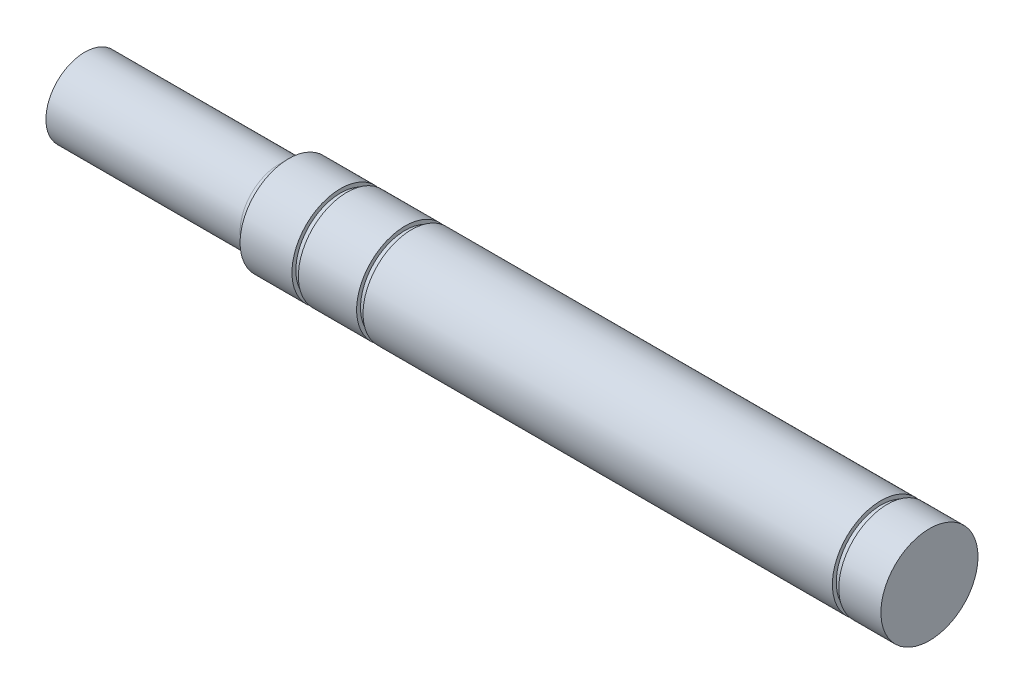
ISO-10303-21;
HEADER;
FILE_DESCRIPTION(('STEP AP214'),'2;1');
FILE_NAME('part.step','',(''),(''),'','','');
FILE_SCHEMA(('AUTOMOTIVE_DESIGN { 1 0 10303 214 1 1 1 1 }'));
ENDSEC;
DATA;
#1=APPLICATION_CONTEXT('core data for automotive mechanical design processes');
#2=APPLICATION_PROTOCOL_DEFINITION('international standard','automotive_design',2000,#1);
#3=PRODUCT_CONTEXT('',#1,'mechanical');
#4=PRODUCT('Part','Part','',(#3));
#5=PRODUCT_RELATED_PRODUCT_CATEGORY('part','',(#4));
#6=PRODUCT_DEFINITION_FORMATION('','',#4);
#7=PRODUCT_DEFINITION_CONTEXT('part definition',#1,'design');
#8=PRODUCT_DEFINITION('design','',#6,#7);
#9=PRODUCT_DEFINITION_SHAPE('','',#8);
#10=(LENGTH_UNIT() NAMED_UNIT(*) SI_UNIT(.MILLI.,.METRE.));
#11=(NAMED_UNIT(*) PLANE_ANGLE_UNIT() SI_UNIT($,.RADIAN.));
#12=(NAMED_UNIT(*) SI_UNIT($,.STERADIAN.) SOLID_ANGLE_UNIT());
#13=UNCERTAINTY_MEASURE_WITH_UNIT(LENGTH_MEASURE(1.E-05),#10,'distance_accuracy_value','');
#14=(GEOMETRIC_REPRESENTATION_CONTEXT(3) GLOBAL_UNCERTAINTY_ASSIGNED_CONTEXT((#13)) GLOBAL_UNIT_ASSIGNED_CONTEXT((#10,
#11,#12)) REPRESENTATION_CONTEXT('',''));
#15=CARTESIAN_POINT('',(0.,0.,0.));
#16=DIRECTION('',(0.,0.,1.));
#17=DIRECTION('',(1.,0.,0.));
#18=AXIS2_PLACEMENT_3D('',#15,#16,#17);
#19=CARTESIAN_POINT('',(-33.2456680527159,0.,0.));
#20=DIRECTION('',(-1.,0.,0.));
#21=DIRECTION('',(0.,0.,1.));
#22=AXIS2_PLACEMENT_3D('',#19,#20,#21);
#23=PLANE('',#22);
#24=CARTESIAN_POINT('',(-33.2456680527159,-282.754869364823,0.));
#25=DIRECTION('',(1.,0.,0.));
#26=DIRECTION('',(0.,0.,-1.));
#27=AXIS2_PLACEMENT_3D('',#24,#25,#26);
#28=CIRCLE('',#27,5.);
#29=CARTESIAN_POINT('',(-33.2456680527159,-282.754869364823,-5.));
#30=VERTEX_POINT('',#29);
#31=EDGE_CURVE('E91',#30,#30,#28,.T.);
#32=ORIENTED_EDGE('',*,*,#31,.T.);
#33=EDGE_LOOP('',(#32));
#34=FACE_BOUND('',#33,.T.);
#35=ADVANCED_FACE('F39',(#34),#23,.F.);
#36=CARTESIAN_POINT('',(-120.245668052716,4.17185966511118E-13,0.));
#37=DIRECTION('',(-1.,0.,0.));
#38=DIRECTION('',(0.,0.,1.));
#39=AXIS2_PLACEMENT_3D('',#36,#37,#38);
#40=PLANE('',#39);
#41=CARTESIAN_POINT('',(-120.245668052716,-282.754869364823,0.));
#42=DIRECTION('',(1.,0.,0.));
#43=DIRECTION('',(0.,0.,-1.));
#44=AXIS2_PLACEMENT_3D('',#41,#42,#43);
#45=CIRCLE('',#44,4.);
#46=CARTESIAN_POINT('',(-120.245668052716,-282.754869364823,-4.));
#47=VERTEX_POINT('',#46);
#48=EDGE_CURVE('E11',#47,#47,#45,.T.);
#49=ORIENTED_EDGE('',*,*,#48,.F.);
#50=EDGE_LOOP('',(#49));
#51=FACE_BOUND('',#50,.T.);
#52=ADVANCED_FACE('F114',(#51),#40,.T.);
#53=CARTESIAN_POINT('',(-33.2456680527159,-282.754869364823,0.));
#54=DIRECTION('',(1.,0.,0.));
#55=DIRECTION('',(0.,0.,-1.));
#56=AXIS2_PLACEMENT_3D('',#53,#54,#55);
#57=CYLINDRICAL_SURFACE('',#56,4.);
#58=CARTESIAN_POINT('',(-100.245668052716,-282.754869364823,0.));
#59=DIRECTION('',(1.,0.,0.));
#60=DIRECTION('',(0.,0.,-1.));
#61=AXIS2_PLACEMENT_3D('',#58,#59,#60);
#62=CIRCLE('',#61,4.);
#63=CARTESIAN_POINT('',(-100.245668052716,-282.754869364823,-4.));
#64=VERTEX_POINT('',#63);
#65=EDGE_CURVE('E45',#64,#64,#62,.T.);
#66=ORIENTED_EDGE('',*,*,#65,.F.);
#67=EDGE_LOOP('',(#66));
#68=FACE_BOUND('',#67,.T.);
#69=ORIENTED_EDGE('',*,*,#48,.T.);
#70=EDGE_LOOP('',(#69));
#71=FACE_BOUND('',#70,.T.);
#72=ADVANCED_FACE('F118',(#68,#71),#57,.T.);
#73=CARTESIAN_POINT('',(-100.245668052716,-282.754869364823,0.));
#74=DIRECTION('',(1.,0.,0.));
#75=DIRECTION('',(0.,0.,-1.));
#76=AXIS2_PLACEMENT_3D('',#73,#74,#75);
#77=TOROIDAL_SURFACE('',#76,5.,1.);
#78=CARTESIAN_POINT('',(-99.2456680527159,-282.754869364823,0.));
#79=DIRECTION('',(1.,0.,0.));
#80=DIRECTION('',(0.,0.,-1.));
#81=AXIS2_PLACEMENT_3D('',#78,#79,#80);
#82=CIRCLE('',#81,5.);
#83=CARTESIAN_POINT('',(-99.2456680527159,-282.754869364823,-5.));
#84=VERTEX_POINT('',#83);
#85=EDGE_CURVE('E49',#84,#84,#82,.T.);
#86=ORIENTED_EDGE('',*,*,#85,.F.);
#87=EDGE_LOOP('',(#86));
#88=FACE_BOUND('',#87,.T.);
#89=ORIENTED_EDGE('',*,*,#65,.T.);
#90=EDGE_LOOP('',(#89));
#91=FACE_BOUND('',#90,.T.);
#92=ADVANCED_FACE('F123',(#88,#91),#77,.F.);
#93=CARTESIAN_POINT('',(-33.2456680527159,-282.754869364823,0.));
#94=DIRECTION('',(1.,0.,0.));
#95=DIRECTION('',(0.,0.,-1.));
#96=AXIS2_PLACEMENT_3D('',#93,#94,#95);
#97=CYLINDRICAL_SURFACE('',#96,5.);
#98=ORIENTED_EDGE('',*,*,#85,.T.);
#99=EDGE_LOOP('',(#98));
#100=FACE_BOUND('',#99,.T.);
#101=CARTESIAN_POINT('',(-93.9056680527159,-282.754869364823,0.));
#102=DIRECTION('',(1.,0.,0.));
#103=DIRECTION('',(0.,0.,-1.));
#104=AXIS2_PLACEMENT_3D('',#101,#102,#103);
#105=CIRCLE('',#104,5.);
#106=CARTESIAN_POINT('',(-93.9056680527159,-282.754869364823,-5.));
#107=VERTEX_POINT('',#106);
#108=EDGE_CURVE('E53',#107,#107,#105,.T.);
#109=ORIENTED_EDGE('',*,*,#108,.F.);
#110=EDGE_LOOP('',(#109));
#111=FACE_BOUND('',#110,.T.);
#112=ADVANCED_FACE('F129',(#100,#111),#97,.T.);
#113=CARTESIAN_POINT('',(-93.9056680527159,0.,0.));
#114=DIRECTION('',(1.,0.,0.));
#115=DIRECTION('',(0.,0.,-1.));
#116=AXIS2_PLACEMENT_3D('',#113,#114,#115);
#117=PLANE('',#116);
#118=ORIENTED_EDGE('',*,*,#108,.T.);
#119=EDGE_LOOP('',(#118));
#120=FACE_BOUND('',#119,.T.);
#121=CARTESIAN_POINT('',(-93.9056680527159,-282.754869364823,0.));
#122=DIRECTION('',(1.,0.,0.));
#123=DIRECTION('',(0.,0.,-1.));
#124=AXIS2_PLACEMENT_3D('',#121,#122,#123);
#125=CIRCLE('',#124,4.59999999999999);
#126=CARTESIAN_POINT('',(-93.9056680527159,-282.754869364823,-4.59999999999999));
#127=VERTEX_POINT('',#126);
#128=EDGE_CURVE('E58',#127,#127,#125,.T.);
#129=ORIENTED_EDGE('',*,*,#128,.F.);
#130=EDGE_LOOP('',(#129));
#131=FACE_BOUND('',#130,.T.);
#132=ADVANCED_FACE('F133',(#120,#131),#117,.T.);
#133=CARTESIAN_POINT('',(-33.2456680527159,-282.754869364823,0.));
#134=DIRECTION('',(1.,0.,0.));
#135=DIRECTION('',(0.,0.,-1.));
#136=AXIS2_PLACEMENT_3D('',#133,#134,#135);
#137=CYLINDRICAL_SURFACE('',#136,4.59999999999999);
#138=ORIENTED_EDGE('',*,*,#128,.T.);
#139=EDGE_LOOP('',(#138));
#140=FACE_BOUND('',#139,.T.);
#141=CARTESIAN_POINT('',(-93.2456680527159,-282.754869364823,0.));
#142=DIRECTION('',(1.,0.,0.));
#143=DIRECTION('',(0.,0.,-1.));
#144=AXIS2_PLACEMENT_3D('',#141,#142,#143);
#145=CIRCLE('',#144,4.59999999999999);
#146=CARTESIAN_POINT('',(-93.2456680527159,-282.754869364823,-4.59999999999999));
#147=VERTEX_POINT('',#146);
#148=EDGE_CURVE('E61',#147,#147,#145,.T.);
#149=ORIENTED_EDGE('',*,*,#148,.F.);
#150=EDGE_LOOP('',(#149));
#151=FACE_BOUND('',#150,.T.);
#152=ADVANCED_FACE('F137',(#140,#151),#137,.T.);
#153=CARTESIAN_POINT('',(-93.2456680527159,0.,0.));
#154=DIRECTION('',(-1.,0.,0.));
#155=DIRECTION('',(0.,0.,1.));
#156=AXIS2_PLACEMENT_3D('',#153,#154,#155);
#157=PLANE('',#156);
#158=ORIENTED_EDGE('',*,*,#148,.T.);
#159=EDGE_LOOP('',(#158));
#160=FACE_BOUND('',#159,.T.);
#161=CARTESIAN_POINT('',(-93.2456680527159,-282.754869364823,0.));
#162=DIRECTION('',(1.,0.,0.));
#163=DIRECTION('',(0.,0.,-1.));
#164=AXIS2_PLACEMENT_3D('',#161,#162,#163);
#165=CIRCLE('',#164,5.);
#166=CARTESIAN_POINT('',(-93.2456680527159,-282.754869364823,-5.));
#167=VERTEX_POINT('',#166);
#168=EDGE_CURVE('E64',#167,#167,#165,.T.);
#169=ORIENTED_EDGE('',*,*,#168,.F.);
#170=EDGE_LOOP('',(#169));
#171=FACE_BOUND('',#170,.T.);
#172=ADVANCED_FACE('F141',(#160,#171),#157,.T.);
#173=CARTESIAN_POINT('',(-33.2456680527159,-282.754869364823,0.));
#174=DIRECTION('',(1.,0.,0.));
#175=DIRECTION('',(0.,0.,-1.));
#176=AXIS2_PLACEMENT_3D('',#173,#174,#175);
#177=CYLINDRICAL_SURFACE('',#176,5.);
#178=ORIENTED_EDGE('',*,*,#168,.T.);
#179=EDGE_LOOP('',(#178));
#180=FACE_BOUND('',#179,.T.);
#181=CARTESIAN_POINT('',(-87.2456680527159,-282.754869364823,0.));
#182=DIRECTION('',(1.,0.,0.));
#183=DIRECTION('',(0.,0.,-1.));
#184=AXIS2_PLACEMENT_3D('',#181,#182,#183);
#185=CIRCLE('',#184,5.);
#186=CARTESIAN_POINT('',(-87.2456680527159,-282.754869364823,-5.));
#187=VERTEX_POINT('',#186);
#188=EDGE_CURVE('E67',#187,#187,#185,.T.);
#189=ORIENTED_EDGE('',*,*,#188,.F.);
#190=EDGE_LOOP('',(#189));
#191=FACE_BOUND('',#190,.T.);
#192=ADVANCED_FACE('F145',(#180,#191),#177,.T.);
#193=CARTESIAN_POINT('',(-87.2456680527159,0.,0.));
#194=DIRECTION('',(-1.,0.,0.));
#195=DIRECTION('',(0.,0.,1.));
#196=AXIS2_PLACEMENT_3D('',#193,#194,#195);
#197=PLANE('',#196);
#198=CARTESIAN_POINT('',(-87.2456680527159,-282.754869364823,0.));
#199=DIRECTION('',(1.,0.,0.));
#200=DIRECTION('',(0.,0.,-1.));
#201=AXIS2_PLACEMENT_3D('',#198,#199,#200);
#202=CIRCLE('',#201,4.59999999999999);
#203=CARTESIAN_POINT('',(-87.2456680527159,-282.754869364823,-4.59999999999999));
#204=VERTEX_POINT('',#203);
#205=EDGE_CURVE('E70',#204,#204,#202,.T.);
#206=ORIENTED_EDGE('',*,*,#205,.F.);
#207=EDGE_LOOP('',(#206));
#208=FACE_BOUND('',#207,.T.);
#209=ORIENTED_EDGE('',*,*,#188,.T.);
#210=EDGE_LOOP('',(#209));
#211=FACE_BOUND('',#210,.T.);
#212=ADVANCED_FACE('F149',(#208,#211),#197,.F.);
#213=CARTESIAN_POINT('',(-33.2456680527159,-282.754869364823,0.));
#214=DIRECTION('',(1.,0.,0.));
#215=DIRECTION('',(0.,0.,-1.));
#216=AXIS2_PLACEMENT_3D('',#213,#214,#215);
#217=CYLINDRICAL_SURFACE('',#216,4.60000000000002);
#218=CARTESIAN_POINT('',(-86.5856680527159,-282.754869364823,0.));
#219=DIRECTION('',(1.,0.,0.));
#220=DIRECTION('',(0.,0.,-1.));
#221=AXIS2_PLACEMENT_3D('',#218,#219,#220);
#222=CIRCLE('',#221,4.60000000000005);
#223=CARTESIAN_POINT('',(-86.5856680527159,-282.754869364823,-4.60000000000005));
#224=VERTEX_POINT('',#223);
#225=EDGE_CURVE('E73',#224,#224,#222,.T.);
#226=ORIENTED_EDGE('',*,*,#225,.F.);
#227=EDGE_LOOP('',(#226));
#228=FACE_BOUND('',#227,.T.);
#229=ORIENTED_EDGE('',*,*,#205,.T.);
#230=EDGE_LOOP('',(#229));
#231=FACE_BOUND('',#230,.T.);
#232=ADVANCED_FACE('F153',(#228,#231),#217,.T.);
#233=CARTESIAN_POINT('',(-86.5856680527159,0.,0.));
#234=DIRECTION('',(1.,0.,0.));
#235=DIRECTION('',(0.,0.,-1.));
#236=AXIS2_PLACEMENT_3D('',#233,#234,#235);
#237=PLANE('',#236);
#238=CARTESIAN_POINT('',(-86.5856680527159,-282.754869364823,0.));
#239=DIRECTION('',(1.,0.,0.));
#240=DIRECTION('',(0.,0.,-1.));
#241=AXIS2_PLACEMENT_3D('',#238,#239,#240);
#242=CIRCLE('',#241,5.);
#243=CARTESIAN_POINT('',(-86.5856680527159,-282.754869364823,-5.));
#244=VERTEX_POINT('',#243);
#245=EDGE_CURVE('E76',#244,#244,#242,.T.);
#246=ORIENTED_EDGE('',*,*,#245,.F.);
#247=EDGE_LOOP('',(#246));
#248=FACE_BOUND('',#247,.T.);
#249=ORIENTED_EDGE('',*,*,#225,.T.);
#250=EDGE_LOOP('',(#249));
#251=FACE_BOUND('',#250,.T.);
#252=ADVANCED_FACE('F157',(#248,#251),#237,.F.);
#253=CARTESIAN_POINT('',(-33.2456680527159,-282.754869364823,0.));
#254=DIRECTION('',(1.,0.,0.));
#255=DIRECTION('',(0.,0.,-1.));
#256=AXIS2_PLACEMENT_3D('',#253,#254,#255);
#257=CYLINDRICAL_SURFACE('',#256,5.);
#258=ORIENTED_EDGE('',*,*,#245,.T.);
#259=EDGE_LOOP('',(#258));
#260=FACE_BOUND('',#259,.T.);
#261=CARTESIAN_POINT('',(-38.2456680527159,-282.754869364823,0.));
#262=DIRECTION('',(1.,0.,0.));
#263=DIRECTION('',(0.,0.,-1.));
#264=AXIS2_PLACEMENT_3D('',#261,#262,#263);
#265=CIRCLE('',#264,5.);
#266=CARTESIAN_POINT('',(-38.2456680527159,-282.754869364823,-5.));
#267=VERTEX_POINT('',#266);
#268=EDGE_CURVE('E79',#267,#267,#265,.T.);
#269=ORIENTED_EDGE('',*,*,#268,.F.);
#270=EDGE_LOOP('',(#269));
#271=FACE_BOUND('',#270,.T.);
#272=ADVANCED_FACE('F161',(#260,#271),#257,.T.);
#273=CARTESIAN_POINT('',(-38.2456680527159,0.,0.));
#274=DIRECTION('',(1.,0.,0.));
#275=DIRECTION('',(0.,0.,-1.));
#276=AXIS2_PLACEMENT_3D('',#273,#274,#275);
#277=PLANE('',#276);
#278=ORIENTED_EDGE('',*,*,#268,.T.);
#279=EDGE_LOOP('',(#278));
#280=FACE_BOUND('',#279,.T.);
#281=CARTESIAN_POINT('',(-38.2456680527159,-282.754869364823,0.));
#282=DIRECTION('',(1.,0.,0.));
#283=DIRECTION('',(0.,0.,-1.));
#284=AXIS2_PLACEMENT_3D('',#281,#282,#283);
#285=CIRCLE('',#284,4.59999999999999);
#286=CARTESIAN_POINT('',(-38.2456680527159,-282.754869364823,-4.59999999999999));
#287=VERTEX_POINT('',#286);
#288=EDGE_CURVE('E82',#287,#287,#285,.T.);
#289=ORIENTED_EDGE('',*,*,#288,.F.);
#290=EDGE_LOOP('',(#289));
#291=FACE_BOUND('',#290,.T.);
#292=ADVANCED_FACE('F110',(#280,#291),#277,.T.);
#293=CARTESIAN_POINT('',(-33.2456680527159,-282.754869364823,0.));
#294=DIRECTION('',(1.,0.,0.));
#295=DIRECTION('',(0.,0.,-1.));
#296=AXIS2_PLACEMENT_3D('',#293,#294,#295);
#297=CYLINDRICAL_SURFACE('',#296,4.59999999999999);
#298=ORIENTED_EDGE('',*,*,#288,.T.);
#299=EDGE_LOOP('',(#298));
#300=FACE_BOUND('',#299,.T.);
#301=CARTESIAN_POINT('',(-37.5856680527159,-282.754869364823,0.));
#302=DIRECTION('',(1.,0.,0.));
#303=DIRECTION('',(0.,0.,-1.));
#304=AXIS2_PLACEMENT_3D('',#301,#302,#303);
#305=CIRCLE('',#304,4.59999999999999);
#306=CARTESIAN_POINT('',(-37.5856680527159,-282.754869364823,-4.59999999999999));
#307=VERTEX_POINT('',#306);
#308=EDGE_CURVE('E85',#307,#307,#305,.T.);
#309=ORIENTED_EDGE('',*,*,#308,.F.);
#310=EDGE_LOOP('',(#309));
#311=FACE_BOUND('',#310,.T.);
#312=ADVANCED_FACE('F104',(#300,#311),#297,.T.);
#313=CARTESIAN_POINT('',(-37.5856680527159,0.,0.));
#314=DIRECTION('',(-1.,0.,0.));
#315=DIRECTION('',(0.,0.,1.));
#316=AXIS2_PLACEMENT_3D('',#313,#314,#315);
#317=PLANE('',#316);
#318=ORIENTED_EDGE('',*,*,#308,.T.);
#319=EDGE_LOOP('',(#318));
#320=FACE_BOUND('',#319,.T.);
#321=CARTESIAN_POINT('',(-37.5856680527159,-282.754869364823,0.));
#322=DIRECTION('',(1.,0.,0.));
#323=DIRECTION('',(0.,0.,-1.));
#324=AXIS2_PLACEMENT_3D('',#321,#322,#323);
#325=CIRCLE('',#324,5.);
#326=CARTESIAN_POINT('',(-37.5856680527159,-282.754869364823,-5.));
#327=VERTEX_POINT('',#326);
#328=EDGE_CURVE('E88',#327,#327,#325,.T.);
#329=ORIENTED_EDGE('',*,*,#328,.F.);
#330=EDGE_LOOP('',(#329));
#331=FACE_BOUND('',#330,.T.);
#332=ADVANCED_FACE('F99',(#320,#331),#317,.T.);
#333=CARTESIAN_POINT('',(-33.2456680527159,-282.754869364823,0.));
#334=DIRECTION('',(1.,0.,0.));
#335=DIRECTION('',(0.,0.,-1.));
#336=AXIS2_PLACEMENT_3D('',#333,#334,#335);
#337=CYLINDRICAL_SURFACE('',#336,5.);
#338=ORIENTED_EDGE('',*,*,#31,.F.);
#339=EDGE_LOOP('',(#338));
#340=FACE_BOUND('',#339,.T.);
#341=ORIENTED_EDGE('',*,*,#328,.T.);
#342=EDGE_LOOP('',(#341));
#343=FACE_BOUND('',#342,.T.);
#344=ADVANCED_FACE('F96',(#340,#343),#337,.T.);
#345=CLOSED_SHELL('',(#35,#52,#72,#92,#112,#132,#152,#172,#192,#212,#232,#252,#272,#292,#312,
#332,#344));
#346=MANIFOLD_SOLID_BREP('B2',#345);
#347=ADVANCED_BREP_SHAPE_REPRESENTATION('',(#18,#346),#14);
#348=SHAPE_DEFINITION_REPRESENTATION(#9,#347);
ENDSEC;
END-ISO-10303-21;
